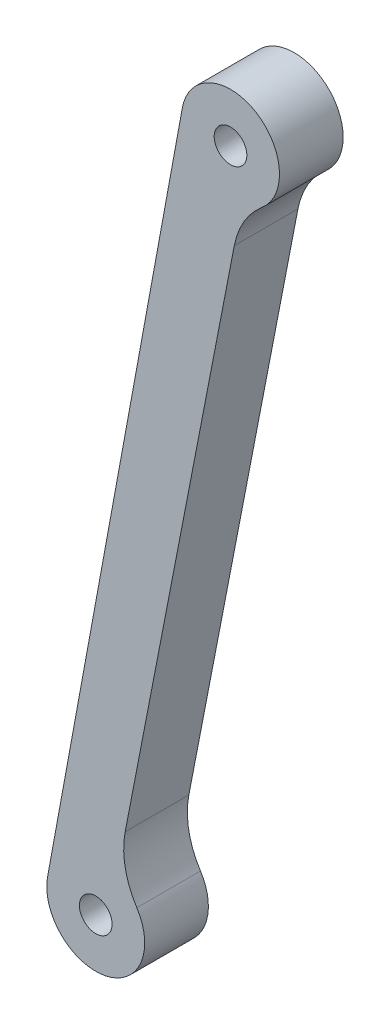
ISO-10303-21;
HEADER;
FILE_DESCRIPTION(('STEP AP214'),'2;1');
FILE_NAME('part.step','',(''),(''),'','','');
FILE_SCHEMA(('AUTOMOTIVE_DESIGN { 1 0 10303 214 1 1 1 1 }'));
ENDSEC;
DATA;
#1=APPLICATION_CONTEXT('core data for automotive mechanical design processes');
#2=APPLICATION_PROTOCOL_DEFINITION('international standard','automotive_design',2000,#1);
#3=PRODUCT_CONTEXT('',#1,'mechanical');
#4=PRODUCT('Part','Part','',(#3));
#5=PRODUCT_RELATED_PRODUCT_CATEGORY('part','',(#4));
#6=PRODUCT_DEFINITION_FORMATION('','',#4);
#7=PRODUCT_DEFINITION_CONTEXT('part definition',#1,'design');
#8=PRODUCT_DEFINITION('design','',#6,#7);
#9=PRODUCT_DEFINITION_SHAPE('','',#8);
#10=(LENGTH_UNIT() NAMED_UNIT(*) SI_UNIT(.MILLI.,.METRE.));
#11=(NAMED_UNIT(*) PLANE_ANGLE_UNIT() SI_UNIT($,.RADIAN.));
#12=(NAMED_UNIT(*) SI_UNIT($,.STERADIAN.) SOLID_ANGLE_UNIT());
#13=UNCERTAINTY_MEASURE_WITH_UNIT(LENGTH_MEASURE(1.E-05),#10,'distance_accuracy_value','');
#14=(GEOMETRIC_REPRESENTATION_CONTEXT(3) GLOBAL_UNCERTAINTY_ASSIGNED_CONTEXT((#13)) GLOBAL_UNIT_ASSIGNED_CONTEXT((#10,
#11,#12)) REPRESENTATION_CONTEXT('',''));
#15=CARTESIAN_POINT('',(0.,0.,0.));
#16=DIRECTION('',(0.,0.,1.));
#17=DIRECTION('',(1.,0.,0.));
#18=AXIS2_PLACEMENT_3D('',#15,#16,#17);
#19=CARTESIAN_POINT('',(31.2850615359514,81.9192149804247,3.9));
#20=DIRECTION('',(0.,0.,-1.));
#21=DIRECTION('',(-1.,0.,0.));
#22=AXIS2_PLACEMENT_3D('',#19,#20,#21);
#23=PLANE('',#22);
#24=CARTESIAN_POINT('',(31.2850615359514,81.9192149804247,3.9));
#25=DIRECTION('',(0.,0.,-1.));
#26=DIRECTION('',(-1.,0.,0.));
#27=AXIS2_PLACEMENT_3D('',#24,#25,#26);
#28=CIRCLE('',#27,5.);
#29=CARTESIAN_POINT('',(26.3766543349856,82.871863262587,3.9));
#30=VERTEX_POINT('',#29);
#31=CARTESIAN_POINT('',(28.0730585094993,85.75106003967,3.9));
#32=VERTEX_POINT('',#31);
#33=EDGE_CURVE('E139',#30,#32,#28,.T.);
#34=ORIENTED_EDGE('',*,*,#33,.T.);
#35=CARTESIAN_POINT('',(26.145856693628,88.0501670752172,3.9));
#36=DIRECTION('',(0.,0.,1.));
#37=DIRECTION('',(1.,0.,0.));
#38=AXIS2_PLACEMENT_3D('',#35,#36,#37);
#39=CIRCLE('',#38,3.);
#40=CARTESIAN_POINT('',(23.1952741449533,88.592442488136,3.9));
#41=VERTEX_POINT('',#40);
#42=EDGE_CURVE('E97',#32,#41,#39,.T.);
#43=ORIENTED_EDGE('',*,*,#42,.T.);
#44=DIRECTION('',(-0.180758470972937,-0.983527516224903,0.));
#45=VECTOR('',#44,1.);
#46=CARTESIAN_POINT('',(14.9394943531754,43.6718003218127,3.9));
#47=LINE('',#46,#45);
#48=CARTESIAN_POINT('',(14.9394943531754,43.6718003218127,3.9));
#49=VERTEX_POINT('',#48);
#50=EDGE_CURVE('E110',#41,#49,#47,.T.);
#51=ORIENTED_EDGE('',*,*,#50,.T.);
#52=CARTESIAN_POINT('',(17.8900769018501,43.1295249088939,3.9));
#53=DIRECTION('',(0.,0.,1.));
#54=DIRECTION('',(1.,0.,0.));
#55=AXIS2_PLACEMENT_3D('',#52,#53,#54);
#56=CIRCLE('',#55,3.);
#57=CARTESIAN_POINT('',(20.406889033319,44.7622088020254,3.9));
#58=VERTEX_POINT('',#57);
#59=EDGE_CURVE('E104',#49,#58,#56,.T.);
#60=ORIENTED_EDGE('',*,*,#59,.T.);
#61=CARTESIAN_POINT('',(24.6015759191005,47.4833486239112,3.9));
#62=DIRECTION('',(0.,0.,-1.));
#63=DIRECTION('',(1.,0.,0.));
#64=AXIS2_PLACEMENT_3D('',#61,#62,#63);
#65=CIRCLE('',#64,5.);
#66=CARTESIAN_POINT('',(19.6931687181346,48.4359969060735,3.9));
#67=VERTEX_POINT('',#66);
#68=EDGE_CURVE('E108',#58,#67,#65,.T.);
#69=ORIENTED_EDGE('',*,*,#68,.T.);
#70=DIRECTION('',(0.190529656432457,0.981681440193166,0.));
#71=VECTOR('',#70,1.);
#72=CARTESIAN_POINT('',(19.6931687181346,48.4359969060735,3.9));
#73=LINE('',#72,#71);
#74=EDGE_CURVE('E60',#67,#30,#73,.T.);
#75=ORIENTED_EDGE('',*,*,#74,.T.);
#76=EDGE_LOOP('',(#34,#43,#51,#60,#69,#75));
#77=FACE_BOUND('',#76,.T.);
#78=CARTESIAN_POINT('',(17.8900769018501,43.1295249088939,3.9));
#79=DIRECTION('',(0.,0.,1.));
#80=DIRECTION('',(1.,0.,0.));
#81=AXIS2_PLACEMENT_3D('',#78,#79,#80);
#82=CIRCLE('',#81,1.);
#83=CARTESIAN_POINT('',(18.8900769018501,43.1295249088939,3.9));
#84=VERTEX_POINT('',#83);
#85=EDGE_CURVE('E132',#84,#84,#82,.T.);
#86=ORIENTED_EDGE('',*,*,#85,.F.);
#87=EDGE_LOOP('',(#86));
#88=FACE_BOUND('',#87,.T.);
#89=CARTESIAN_POINT('',(26.145856693628,88.0501670752172,3.9));
#90=DIRECTION('',(0.,0.,1.));
#91=DIRECTION('',(1.,0.,0.));
#92=AXIS2_PLACEMENT_3D('',#89,#90,#91);
#93=CIRCLE('',#92,1.);
#94=CARTESIAN_POINT('',(27.145856693628,88.0501670752172,3.9));
#95=VERTEX_POINT('',#94);
#96=EDGE_CURVE('E180',#95,#95,#93,.T.);
#97=ORIENTED_EDGE('',*,*,#96,.F.);
#98=EDGE_LOOP('',(#97));
#99=FACE_BOUND('',#98,.T.);
#100=ADVANCED_FACE('F43',(#77,#88,#99),#23,.F.);
#101=CARTESIAN_POINT('',(31.2850615359514,81.9192149804247,0.));
#102=DIRECTION('',(0.,0.,-1.));
#103=DIRECTION('',(-1.,0.,0.));
#104=AXIS2_PLACEMENT_3D('',#101,#102,#103);
#105=PLANE('',#104);
#106=CARTESIAN_POINT('',(17.8900769018501,43.1295249088939,0.));
#107=DIRECTION('',(0.,0.,1.));
#108=DIRECTION('',(1.,0.,0.));
#109=AXIS2_PLACEMENT_3D('',#106,#107,#108);
#110=CIRCLE('',#109,1.);
#111=CARTESIAN_POINT('',(18.8900769018501,43.1295249088939,0.));
#112=VERTEX_POINT('',#111);
#113=EDGE_CURVE('E185',#112,#112,#110,.T.);
#114=ORIENTED_EDGE('',*,*,#113,.T.);
#115=EDGE_LOOP('',(#114));
#116=FACE_BOUND('',#115,.T.);
#117=CARTESIAN_POINT('',(31.2850615359514,81.9192149804247,0.));
#118=DIRECTION('',(0.,0.,-1.));
#119=DIRECTION('',(-1.,0.,0.));
#120=AXIS2_PLACEMENT_3D('',#117,#118,#119);
#121=CIRCLE('',#120,5.);
#122=CARTESIAN_POINT('',(26.3766543349856,82.871863262587,0.));
#123=VERTEX_POINT('',#122);
#124=CARTESIAN_POINT('',(28.0730585094993,85.75106003967,0.));
#125=VERTEX_POINT('',#124);
#126=EDGE_CURVE('E128',#123,#125,#121,.T.);
#127=ORIENTED_EDGE('',*,*,#126,.F.);
#128=DIRECTION('',(0.190529656432457,0.981681440193166,0.));
#129=VECTOR('',#128,1.);
#130=CARTESIAN_POINT('',(19.6931687181346,48.4359969060735,0.));
#131=LINE('',#130,#129);
#132=CARTESIAN_POINT('',(19.6931687181346,48.4359969060735,0.));
#133=VERTEX_POINT('',#132);
#134=EDGE_CURVE('E89',#133,#123,#131,.T.);
#135=ORIENTED_EDGE('',*,*,#134,.F.);
#136=CARTESIAN_POINT('',(24.6015759191005,47.4833486239112,0.));
#137=DIRECTION('',(0.,0.,-1.));
#138=DIRECTION('',(1.,0.,0.));
#139=AXIS2_PLACEMENT_3D('',#136,#137,#138);
#140=CIRCLE('',#139,5.);
#141=CARTESIAN_POINT('',(20.406889033319,44.7622088020254,0.));
#142=VERTEX_POINT('',#141);
#143=EDGE_CURVE('E83',#142,#133,#140,.T.);
#144=ORIENTED_EDGE('',*,*,#143,.F.);
#145=CARTESIAN_POINT('',(17.8900769018501,43.1295249088939,0.));
#146=DIRECTION('',(0.,0.,1.));
#147=DIRECTION('',(1.,0.,0.));
#148=AXIS2_PLACEMENT_3D('',#145,#146,#147);
#149=CIRCLE('',#148,3.);
#150=CARTESIAN_POINT('',(14.9394943531754,43.6718003218127,0.));
#151=VERTEX_POINT('',#150);
#152=EDGE_CURVE('E118',#151,#142,#149,.T.);
#153=ORIENTED_EDGE('',*,*,#152,.F.);
#154=DIRECTION('',(-0.180758470972937,-0.983527516224903,0.));
#155=VECTOR('',#154,1.);
#156=CARTESIAN_POINT('',(14.9394943531754,43.6718003218127,0.));
#157=LINE('',#156,#155);
#158=CARTESIAN_POINT('',(23.1952741449533,88.592442488136,0.));
#159=VERTEX_POINT('',#158);
#160=EDGE_CURVE('E134',#159,#151,#157,.T.);
#161=ORIENTED_EDGE('',*,*,#160,.F.);
#162=CARTESIAN_POINT('',(26.145856693628,88.0501670752172,0.));
#163=DIRECTION('',(0.,0.,1.));
#164=DIRECTION('',(1.,0.,0.));
#165=AXIS2_PLACEMENT_3D('',#162,#163,#164);
#166=CIRCLE('',#165,3.);
#167=EDGE_CURVE('E131',#125,#159,#166,.T.);
#168=ORIENTED_EDGE('',*,*,#167,.F.);
#169=EDGE_LOOP('',(#127,#135,#144,#153,#161,#168));
#170=FACE_BOUND('',#169,.T.);
#171=CARTESIAN_POINT('',(26.145856693628,88.0501670752172,0.));
#172=DIRECTION('',(0.,0.,1.));
#173=DIRECTION('',(1.,0.,0.));
#174=AXIS2_PLACEMENT_3D('',#171,#172,#173);
#175=CIRCLE('',#174,1.);
#176=CARTESIAN_POINT('',(27.145856693628,88.0501670752172,0.));
#177=VERTEX_POINT('',#176);
#178=EDGE_CURVE('E183',#177,#177,#175,.T.);
#179=ORIENTED_EDGE('',*,*,#178,.T.);
#180=EDGE_LOOP('',(#179));
#181=FACE_BOUND('',#180,.T.);
#182=ADVANCED_FACE('F148',(#116,#170,#181),#105,.T.);
#183=CARTESIAN_POINT('',(31.2850615359514,81.9192149804247,3.9));
#184=DIRECTION('',(0.,0.,-1.));
#185=DIRECTION('',(-1.,0.,0.));
#186=AXIS2_PLACEMENT_3D('',#183,#184,#185);
#187=CYLINDRICAL_SURFACE('',#186,5.);
#188=ORIENTED_EDGE('',*,*,#126,.T.);
#189=DIRECTION('',(0.,0.,-1.));
#190=VECTOR('',#189,1.);
#191=CARTESIAN_POINT('',(28.0730585094993,85.75106003967,3.9));
#192=LINE('',#191,#190);
#193=EDGE_CURVE('E13',#32,#125,#192,.T.);
#194=ORIENTED_EDGE('',*,*,#193,.F.);
#195=ORIENTED_EDGE('',*,*,#33,.F.);
#196=DIRECTION('',(0.,0.,-1.));
#197=VECTOR('',#196,1.);
#198=CARTESIAN_POINT('',(26.3766543349856,82.871863262587,3.9));
#199=LINE('',#198,#197);
#200=EDGE_CURVE('E124',#30,#123,#199,.T.);
#201=ORIENTED_EDGE('',*,*,#200,.T.);
#202=EDGE_LOOP('',(#188,#194,#195,#201));
#203=FACE_BOUND('',#202,.T.);
#204=ADVANCED_FACE('F45',(#203),#187,.F.);
#205=CARTESIAN_POINT('',(26.145856693628,88.0501670752172,3.9));
#206=DIRECTION('',(0.,0.,-1.));
#207=DIRECTION('',(-1.,0.,0.));
#208=AXIS2_PLACEMENT_3D('',#205,#206,#207);
#209=CYLINDRICAL_SURFACE('',#208,3.);
#210=ORIENTED_EDGE('',*,*,#167,.T.);
#211=DIRECTION('',(0.,0.,-1.));
#212=VECTOR('',#211,1.);
#213=CARTESIAN_POINT('',(23.1952741449533,88.592442488136,3.9));
#214=LINE('',#213,#212);
#215=EDGE_CURVE('E52',#41,#159,#214,.T.);
#216=ORIENTED_EDGE('',*,*,#215,.F.);
#217=ORIENTED_EDGE('',*,*,#42,.F.);
#218=ORIENTED_EDGE('',*,*,#193,.T.);
#219=EDGE_LOOP('',(#210,#216,#217,#218));
#220=FACE_BOUND('',#219,.T.);
#221=ADVANCED_FACE('F228',(#220),#209,.T.);
#222=CARTESIAN_POINT('',(14.9394943531754,43.6718003218127,3.9));
#223=DIRECTION('',(0.983527516224902,-0.180758470972937,0.));
#224=DIRECTION('',(0.180758470972937,0.983527516224903,0.));
#225=AXIS2_PLACEMENT_3D('',#222,#223,#224);
#226=PLANE('',#225);
#227=ORIENTED_EDGE('',*,*,#160,.T.);
#228=DIRECTION('',(0.,0.,-1.));
#229=VECTOR('',#228,1.);
#230=CARTESIAN_POINT('',(14.9394943531754,43.6718003218127,3.9));
#231=LINE('',#230,#229);
#232=EDGE_CURVE('E119',#49,#151,#231,.T.);
#233=ORIENTED_EDGE('',*,*,#232,.F.);
#234=ORIENTED_EDGE('',*,*,#50,.F.);
#235=ORIENTED_EDGE('',*,*,#215,.T.);
#236=EDGE_LOOP('',(#227,#233,#234,#235));
#237=FACE_BOUND('',#236,.T.);
#238=ADVANCED_FACE('F145',(#237),#226,.F.);
#239=CARTESIAN_POINT('',(17.8900769018501,43.1295249088939,3.9));
#240=DIRECTION('',(0.,0.,-1.));
#241=DIRECTION('',(-1.,0.,0.));
#242=AXIS2_PLACEMENT_3D('',#239,#240,#241);
#243=CYLINDRICAL_SURFACE('',#242,3.);
#244=ORIENTED_EDGE('',*,*,#152,.T.);
#245=DIRECTION('',(0.,0.,-1.));
#246=VECTOR('',#245,1.);
#247=CARTESIAN_POINT('',(20.406889033319,44.7622088020254,3.9));
#248=LINE('',#247,#246);
#249=EDGE_CURVE('E115',#58,#142,#248,.T.);
#250=ORIENTED_EDGE('',*,*,#249,.F.);
#251=ORIENTED_EDGE('',*,*,#59,.F.);
#252=ORIENTED_EDGE('',*,*,#232,.T.);
#253=EDGE_LOOP('',(#244,#250,#251,#252));
#254=FACE_BOUND('',#253,.T.);
#255=ADVANCED_FACE('F116',(#254),#243,.T.);
#256=CARTESIAN_POINT('',(24.6015759191005,47.4833486239112,3.9));
#257=DIRECTION('',(0.,0.,-1.));
#258=DIRECTION('',(-1.,0.,0.));
#259=AXIS2_PLACEMENT_3D('',#256,#257,#258);
#260=CYLINDRICAL_SURFACE('',#259,5.);
#261=ORIENTED_EDGE('',*,*,#143,.T.);
#262=DIRECTION('',(0.,0.,-1.));
#263=VECTOR('',#262,1.);
#264=CARTESIAN_POINT('',(19.6931687181346,48.4359969060735,3.9));
#265=LINE('',#264,#263);
#266=EDGE_CURVE('E120',#67,#133,#265,.T.);
#267=ORIENTED_EDGE('',*,*,#266,.F.);
#268=ORIENTED_EDGE('',*,*,#68,.F.);
#269=ORIENTED_EDGE('',*,*,#249,.T.);
#270=EDGE_LOOP('',(#261,#267,#268,#269));
#271=FACE_BOUND('',#270,.T.);
#272=ADVANCED_FACE('F122',(#271),#260,.F.);
#273=CARTESIAN_POINT('',(19.6931687181346,48.4359969060735,3.9));
#274=DIRECTION('',(-0.981681440193167,0.190529656432457,0.));
#275=DIRECTION('',(-0.190529656432457,-0.981681440193167,0.));
#276=AXIS2_PLACEMENT_3D('',#273,#274,#275);
#277=PLANE('',#276);
#278=ORIENTED_EDGE('',*,*,#134,.T.);
#279=ORIENTED_EDGE('',*,*,#200,.F.);
#280=ORIENTED_EDGE('',*,*,#74,.F.);
#281=ORIENTED_EDGE('',*,*,#266,.T.);
#282=EDGE_LOOP('',(#278,#279,#280,#281));
#283=FACE_BOUND('',#282,.T.);
#284=ADVANCED_FACE('F153',(#283),#277,.F.);
#285=CARTESIAN_POINT('',(17.8900769018501,43.1295249088939,3.9));
#286=DIRECTION('',(0.,0.,-1.));
#287=DIRECTION('',(-1.,0.,0.));
#288=AXIS2_PLACEMENT_3D('',#285,#286,#287);
#289=CYLINDRICAL_SURFACE('',#288,1.);
#290=ORIENTED_EDGE('',*,*,#85,.T.);
#291=EDGE_LOOP('',(#290));
#292=FACE_BOUND('',#291,.T.);
#293=ORIENTED_EDGE('',*,*,#113,.F.);
#294=EDGE_LOOP('',(#293));
#295=FACE_BOUND('',#294,.T.);
#296=ADVANCED_FACE('F155',(#292,#295),#289,.F.);
#297=CARTESIAN_POINT('',(26.145856693628,88.0501670752172,3.9));
#298=DIRECTION('',(0.,0.,-1.));
#299=DIRECTION('',(-1.,0.,0.));
#300=AXIS2_PLACEMENT_3D('',#297,#298,#299);
#301=CYLINDRICAL_SURFACE('',#300,1.);
#302=ORIENTED_EDGE('',*,*,#96,.T.);
#303=EDGE_LOOP('',(#302));
#304=FACE_BOUND('',#303,.T.);
#305=ORIENTED_EDGE('',*,*,#178,.F.);
#306=EDGE_LOOP('',(#305));
#307=FACE_BOUND('',#306,.T.);
#308=ADVANCED_FACE('F161',(#304,#307),#301,.F.);
#309=CLOSED_SHELL('',(#100,#182,#204,#221,#238,#255,#272,#284,#296,#308));
#310=MANIFOLD_SOLID_BREP('B2',#309);
#311=ADVANCED_BREP_SHAPE_REPRESENTATION('',(#18,#310),#14);
#312=SHAPE_DEFINITION_REPRESENTATION(#9,#311);
ENDSEC;
END-ISO-10303-21;
